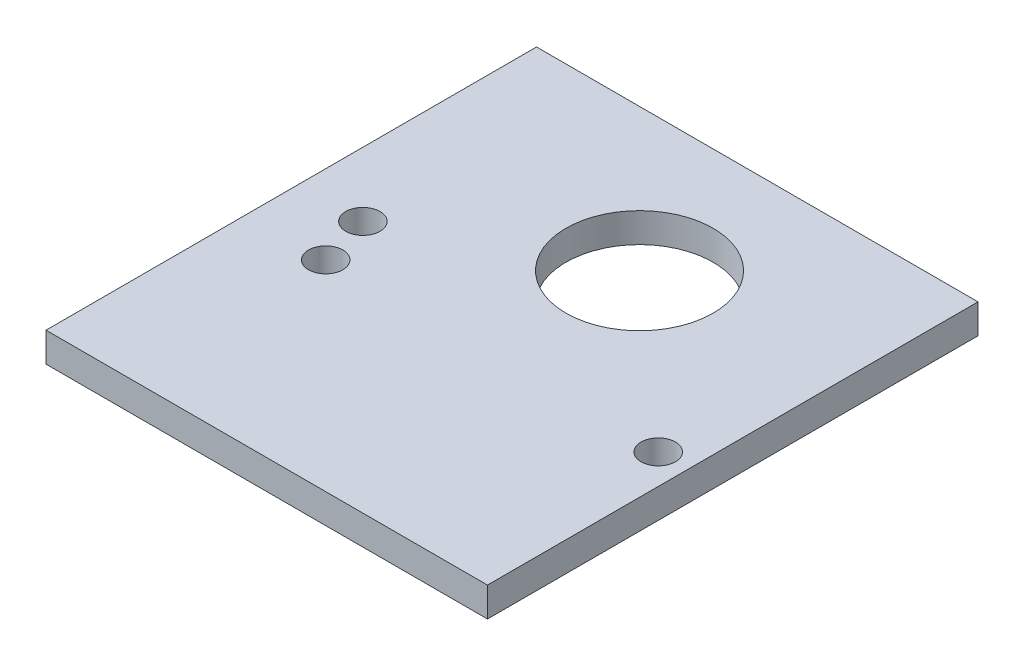
ISO-10303-21;
HEADER;
FILE_DESCRIPTION(('STEP AP214'),'2;1');
FILE_NAME('part.step','',(''),(''),'','','');
FILE_SCHEMA(('AUTOMOTIVE_DESIGN { 1 0 10303 214 1 1 1 1 }'));
ENDSEC;
DATA;
#1=APPLICATION_CONTEXT('core data for automotive mechanical design processes');
#2=APPLICATION_PROTOCOL_DEFINITION('international standard','automotive_design',2000,#1);
#3=PRODUCT_CONTEXT('',#1,'mechanical');
#4=PRODUCT('Part','Part','',(#3));
#5=PRODUCT_RELATED_PRODUCT_CATEGORY('part','',(#4));
#6=PRODUCT_DEFINITION_FORMATION('','',#4);
#7=PRODUCT_DEFINITION_CONTEXT('part definition',#1,'design');
#8=PRODUCT_DEFINITION('design','',#6,#7);
#9=PRODUCT_DEFINITION_SHAPE('','',#8);
#10=(LENGTH_UNIT() NAMED_UNIT(*) SI_UNIT(.MILLI.,.METRE.));
#11=(NAMED_UNIT(*) PLANE_ANGLE_UNIT() SI_UNIT($,.RADIAN.));
#12=(NAMED_UNIT(*) SI_UNIT($,.STERADIAN.) SOLID_ANGLE_UNIT());
#13=UNCERTAINTY_MEASURE_WITH_UNIT(LENGTH_MEASURE(1.E-05),#10,'distance_accuracy_value','');
#14=(GEOMETRIC_REPRESENTATION_CONTEXT(3) GLOBAL_UNCERTAINTY_ASSIGNED_CONTEXT((#13)) GLOBAL_UNIT_ASSIGNED_CONTEXT((#10,
#11,#12)) REPRESENTATION_CONTEXT('',''));
#15=CARTESIAN_POINT('',(0.,0.,0.));
#16=DIRECTION('',(0.,0.,1.));
#17=DIRECTION('',(1.,0.,0.));
#18=AXIS2_PLACEMENT_3D('',#15,#16,#17);
#19=CARTESIAN_POINT('',(-25.,-3.,-22.5));
#20=DIRECTION('',(-1.,0.,0.));
#21=DIRECTION('',(0.,0.,1.));
#22=AXIS2_PLACEMENT_3D('',#19,#20,#21);
#23=PLANE('',#22);
#24=DIRECTION('',(0.,0.,1.));
#25=VECTOR('',#24,1.);
#26=CARTESIAN_POINT('',(-25.,0.,-22.5));
#27=LINE('',#26,#25);
#28=CARTESIAN_POINT('',(-25.,0.,-22.5));
#29=VERTEX_POINT('',#28);
#30=CARTESIAN_POINT('',(-25.,0.,27.5));
#31=VERTEX_POINT('',#30);
#32=EDGE_CURVE('E100',#29,#31,#27,.T.);
#33=ORIENTED_EDGE('',*,*,#32,.F.);
#34=DIRECTION('',(0.,1.,0.));
#35=VECTOR('',#34,1.);
#36=CARTESIAN_POINT('',(-25.,-3.,-22.5));
#37=LINE('',#36,#35);
#38=CARTESIAN_POINT('',(-25.,-3.,-22.5));
#39=VERTEX_POINT('',#38);
#40=EDGE_CURVE('E11',#39,#29,#37,.T.);
#41=ORIENTED_EDGE('',*,*,#40,.F.);
#42=DIRECTION('',(0.,0.,1.));
#43=VECTOR('',#42,1.);
#44=CARTESIAN_POINT('',(-25.,-3.,-22.5));
#45=LINE('',#44,#43);
#46=CARTESIAN_POINT('',(-25.,-3.,27.5));
#47=VERTEX_POINT('',#46);
#48=EDGE_CURVE('E93',#39,#47,#45,.T.);
#49=ORIENTED_EDGE('',*,*,#48,.T.);
#50=DIRECTION('',(0.,1.,0.));
#51=VECTOR('',#50,1.);
#52=CARTESIAN_POINT('',(-25.,-3.,27.5));
#53=LINE('',#52,#51);
#54=EDGE_CURVE('E38',#47,#31,#53,.T.);
#55=ORIENTED_EDGE('',*,*,#54,.T.);
#56=EDGE_LOOP('',(#33,#41,#49,#55));
#57=FACE_BOUND('',#56,.T.);
#58=ADVANCED_FACE('F35',(#57),#23,.T.);
#59=CARTESIAN_POINT('',(-25.,-3.,-22.5));
#60=DIRECTION('',(0.,0.,-1.));
#61=DIRECTION('',(-1.,0.,0.));
#62=AXIS2_PLACEMENT_3D('',#59,#60,#61);
#63=PLANE('',#62);
#64=DIRECTION('',(-1.,0.,0.));
#65=VECTOR('',#64,1.);
#66=CARTESIAN_POINT('',(-25.,0.,-22.5));
#67=LINE('',#66,#65);
#68=CARTESIAN_POINT('',(20.,0.,-22.5));
#69=VERTEX_POINT('',#68);
#70=EDGE_CURVE('E95',#69,#29,#67,.T.);
#71=ORIENTED_EDGE('',*,*,#70,.F.);
#72=DIRECTION('',(0.,1.,0.));
#73=VECTOR('',#72,1.);
#74=CARTESIAN_POINT('',(20.,-3.,-22.5));
#75=LINE('',#74,#73);
#76=CARTESIAN_POINT('',(20.,-3.,-22.5));
#77=VERTEX_POINT('',#76);
#78=EDGE_CURVE('E44',#77,#69,#75,.T.);
#79=ORIENTED_EDGE('',*,*,#78,.F.);
#80=DIRECTION('',(-1.,0.,0.));
#81=VECTOR('',#80,1.);
#82=CARTESIAN_POINT('',(-25.,-3.,-22.5));
#83=LINE('',#82,#81);
#84=EDGE_CURVE('E90',#77,#39,#83,.T.);
#85=ORIENTED_EDGE('',*,*,#84,.T.);
#86=ORIENTED_EDGE('',*,*,#40,.T.);
#87=EDGE_LOOP('',(#71,#79,#85,#86));
#88=FACE_BOUND('',#87,.T.);
#89=ADVANCED_FACE('F111',(#88),#63,.T.);
#90=CARTESIAN_POINT('',(20.,-3.,-22.5));
#91=DIRECTION('',(1.,0.,0.));
#92=DIRECTION('',(0.,0.,-1.));
#93=AXIS2_PLACEMENT_3D('',#90,#91,#92);
#94=PLANE('',#93);
#95=DIRECTION('',(0.,0.,-1.));
#96=VECTOR('',#95,1.);
#97=CARTESIAN_POINT('',(20.,0.,-22.5));
#98=LINE('',#97,#96);
#99=CARTESIAN_POINT('',(20.,0.,27.5));
#100=VERTEX_POINT('',#99);
#101=EDGE_CURVE('E85',#100,#69,#98,.T.);
#102=ORIENTED_EDGE('',*,*,#101,.F.);
#103=DIRECTION('',(0.,1.,0.));
#104=VECTOR('',#103,1.);
#105=CARTESIAN_POINT('',(20.,-3.,27.5));
#106=LINE('',#105,#104);
#107=CARTESIAN_POINT('',(20.,-3.,27.5));
#108=VERTEX_POINT('',#107);
#109=EDGE_CURVE('E80',#108,#100,#106,.T.);
#110=ORIENTED_EDGE('',*,*,#109,.F.);
#111=DIRECTION('',(0.,0.,-1.));
#112=VECTOR('',#111,1.);
#113=CARTESIAN_POINT('',(20.,-3.,-22.5));
#114=LINE('',#113,#112);
#115=EDGE_CURVE('E83',#108,#77,#114,.T.);
#116=ORIENTED_EDGE('',*,*,#115,.T.);
#117=ORIENTED_EDGE('',*,*,#78,.T.);
#118=EDGE_LOOP('',(#102,#110,#116,#117));
#119=FACE_BOUND('',#118,.T.);
#120=ADVANCED_FACE('F82',(#119),#94,.T.);
#121=CARTESIAN_POINT('',(-25.,-3.,27.5));
#122=DIRECTION('',(0.,0.,1.));
#123=DIRECTION('',(1.,0.,0.));
#124=AXIS2_PLACEMENT_3D('',#121,#122,#123);
#125=PLANE('',#124);
#126=DIRECTION('',(1.,0.,0.));
#127=VECTOR('',#126,1.);
#128=CARTESIAN_POINT('',(-25.,0.,27.5));
#129=LINE('',#128,#127);
#130=EDGE_CURVE('E103',#31,#100,#129,.T.);
#131=ORIENTED_EDGE('',*,*,#130,.F.);
#132=ORIENTED_EDGE('',*,*,#54,.F.);
#133=DIRECTION('',(1.,0.,0.));
#134=VECTOR('',#133,1.);
#135=CARTESIAN_POINT('',(-25.,-3.,27.5));
#136=LINE('',#135,#134);
#137=EDGE_CURVE('E89',#47,#108,#136,.T.);
#138=ORIENTED_EDGE('',*,*,#137,.T.);
#139=ORIENTED_EDGE('',*,*,#109,.T.);
#140=EDGE_LOOP('',(#131,#132,#138,#139));
#141=FACE_BOUND('',#140,.T.);
#142=ADVANCED_FACE('F92',(#141),#125,.T.);
#143=CARTESIAN_POINT('',(0.,-3.,0.));
#144=DIRECTION('',(0.,1.,0.));
#145=DIRECTION('',(0.,0.,1.));
#146=AXIS2_PLACEMENT_3D('',#143,#144,#145);
#147=PLANE('',#146);
#148=CARTESIAN_POINT('',(-16.95,-3.,7.04150262212918));
#149=DIRECTION('',(0.,1.,0.));
#150=DIRECTION('',(0.,0.,1.));
#151=AXIS2_PLACEMENT_3D('',#148,#149,#150);
#152=CIRCLE('',#151,1.75);
#153=CARTESIAN_POINT('',(-16.95,-3.,8.79150262212918));
#154=VERTEX_POINT('',#153);
#155=EDGE_CURVE('E152',#154,#154,#152,.F.);
#156=ORIENTED_EDGE('',*,*,#155,.F.);
#157=EDGE_LOOP('',(#156));
#158=FACE_BOUND('',#157,.T.);
#159=CARTESIAN_POINT('',(16.95,-3.,7.04150262212918));
#160=DIRECTION('',(0.,1.,0.));
#161=DIRECTION('',(0.,0.,1.));
#162=AXIS2_PLACEMENT_3D('',#159,#160,#161);
#163=CIRCLE('',#162,1.75);
#164=CARTESIAN_POINT('',(16.95,-3.,8.79150262212918));
#165=VERTEX_POINT('',#164);
#166=EDGE_CURVE('E162',#165,#165,#163,.F.);
#167=ORIENTED_EDGE('',*,*,#166,.F.);
#168=EDGE_LOOP('',(#167));
#169=FACE_BOUND('',#168,.T.);
#170=CARTESIAN_POINT('',(-18.45,-3.,1.75));
#171=DIRECTION('',(0.,1.,0.));
#172=DIRECTION('',(0.,0.,1.));
#173=AXIS2_PLACEMENT_3D('',#170,#171,#172);
#174=CIRCLE('',#173,1.75);
#175=CARTESIAN_POINT('',(-18.45,-3.,3.5));
#176=VERTEX_POINT('',#175);
#177=EDGE_CURVE('E168',#176,#176,#174,.F.);
#178=ORIENTED_EDGE('',*,*,#177,.F.);
#179=EDGE_LOOP('',(#178));
#180=FACE_BOUND('',#179,.T.);
#181=CARTESIAN_POINT('',(0.,-3.,-8.));
#182=DIRECTION('',(0.,1.,0.));
#183=DIRECTION('',(0.,0.,1.));
#184=AXIS2_PLACEMENT_3D('',#181,#182,#183);
#185=CIRCLE('',#184,7.5);
#186=CARTESIAN_POINT('',(0.,-3.,-0.5));
#187=VERTEX_POINT('',#186);
#188=EDGE_CURVE('E104',#187,#187,#185,.T.);
#189=ORIENTED_EDGE('',*,*,#188,.T.);
#190=EDGE_LOOP('',(#189));
#191=FACE_BOUND('',#190,.T.);
#192=ORIENTED_EDGE('',*,*,#48,.F.);
#193=ORIENTED_EDGE('',*,*,#84,.F.);
#194=ORIENTED_EDGE('',*,*,#115,.F.);
#195=ORIENTED_EDGE('',*,*,#137,.F.);
#196=EDGE_LOOP('',(#192,#193,#194,#195));
#197=FACE_BOUND('',#196,.T.);
#198=ADVANCED_FACE('F88',(#158,#169,#180,#191,#197),#147,.F.);
#199=CARTESIAN_POINT('',(0.,0.,0.));
#200=DIRECTION('',(0.,1.,0.));
#201=DIRECTION('',(0.,0.,1.));
#202=AXIS2_PLACEMENT_3D('',#199,#200,#201);
#203=PLANE('',#202);
#204=CARTESIAN_POINT('',(-16.95,0.,7.04150262212918));
#205=DIRECTION('',(0.,1.,0.));
#206=DIRECTION('',(0.,0.,1.));
#207=AXIS2_PLACEMENT_3D('',#204,#205,#206);
#208=CIRCLE('',#207,1.75);
#209=CARTESIAN_POINT('',(-16.95,0.,8.79150262212918));
#210=VERTEX_POINT('',#209);
#211=EDGE_CURVE('E155',#210,#210,#208,.T.);
#212=ORIENTED_EDGE('',*,*,#211,.F.);
#213=EDGE_LOOP('',(#212));
#214=FACE_BOUND('',#213,.T.);
#215=CARTESIAN_POINT('',(16.95,0.,7.04150262212918));
#216=DIRECTION('',(0.,1.,0.));
#217=DIRECTION('',(0.,0.,1.));
#218=AXIS2_PLACEMENT_3D('',#215,#216,#217);
#219=CIRCLE('',#218,1.75);
#220=CARTESIAN_POINT('',(16.95,0.,8.79150262212918));
#221=VERTEX_POINT('',#220);
#222=EDGE_CURVE('E157',#221,#221,#219,.T.);
#223=ORIENTED_EDGE('',*,*,#222,.F.);
#224=EDGE_LOOP('',(#223));
#225=FACE_BOUND('',#224,.T.);
#226=CARTESIAN_POINT('',(-18.45,0.,1.75));
#227=DIRECTION('',(0.,1.,0.));
#228=DIRECTION('',(0.,0.,1.));
#229=AXIS2_PLACEMENT_3D('',#226,#227,#228);
#230=CIRCLE('',#229,1.75);
#231=CARTESIAN_POINT('',(-18.45,0.,3.5));
#232=VERTEX_POINT('',#231);
#233=EDGE_CURVE('E165',#232,#232,#230,.T.);
#234=ORIENTED_EDGE('',*,*,#233,.F.);
#235=EDGE_LOOP('',(#234));
#236=FACE_BOUND('',#235,.T.);
#237=CARTESIAN_POINT('',(0.,0.,-8.));
#238=DIRECTION('',(0.,1.,0.));
#239=DIRECTION('',(0.,0.,1.));
#240=AXIS2_PLACEMENT_3D('',#237,#238,#239);
#241=CIRCLE('',#240,7.5);
#242=CARTESIAN_POINT('',(0.,0.,-0.5));
#243=VERTEX_POINT('',#242);
#244=EDGE_CURVE('E171',#243,#243,#241,.T.);
#245=ORIENTED_EDGE('',*,*,#244,.F.);
#246=EDGE_LOOP('',(#245));
#247=FACE_BOUND('',#246,.T.);
#248=ORIENTED_EDGE('',*,*,#32,.T.);
#249=ORIENTED_EDGE('',*,*,#130,.T.);
#250=ORIENTED_EDGE('',*,*,#101,.T.);
#251=ORIENTED_EDGE('',*,*,#70,.T.);
#252=EDGE_LOOP('',(#248,#249,#250,#251));
#253=FACE_BOUND('',#252,.T.);
#254=ADVANCED_FACE('F110',(#214,#225,#236,#247,#253),#203,.T.);
#255=CARTESIAN_POINT('',(0.,-3.,-8.));
#256=DIRECTION('',(0.,1.,0.));
#257=DIRECTION('',(0.,0.,1.));
#258=AXIS2_PLACEMENT_3D('',#255,#256,#257);
#259=CYLINDRICAL_SURFACE('',#258,7.5);
#260=ORIENTED_EDGE('',*,*,#188,.F.);
#261=EDGE_LOOP('',(#260));
#262=FACE_BOUND('',#261,.T.);
#263=ORIENTED_EDGE('',*,*,#244,.T.);
#264=EDGE_LOOP('',(#263));
#265=FACE_BOUND('',#264,.T.);
#266=ADVANCED_FACE('F129',(#262,#265),#259,.F.);
#267=CARTESIAN_POINT('',(-18.45,-7.94974746830584,1.75));
#268=DIRECTION('',(0.,1.,0.));
#269=DIRECTION('',(0.,0.,1.));
#270=AXIS2_PLACEMENT_3D('',#267,#268,#269);
#271=CYLINDRICAL_SURFACE('',#270,1.75);
#272=ORIENTED_EDGE('',*,*,#177,.T.);
#273=EDGE_LOOP('',(#272));
#274=FACE_BOUND('',#273,.T.);
#275=ORIENTED_EDGE('',*,*,#233,.T.);
#276=EDGE_LOOP('',(#275));
#277=FACE_BOUND('',#276,.T.);
#278=ADVANCED_FACE('F136',(#274,#277),#271,.F.);
#279=CARTESIAN_POINT('',(16.95,-7.94974746830584,7.04150262212918));
#280=DIRECTION('',(0.,1.,0.));
#281=DIRECTION('',(0.,0.,1.));
#282=AXIS2_PLACEMENT_3D('',#279,#280,#281);
#283=CYLINDRICAL_SURFACE('',#282,1.75);
#284=ORIENTED_EDGE('',*,*,#166,.T.);
#285=EDGE_LOOP('',(#284));
#286=FACE_BOUND('',#285,.T.);
#287=ORIENTED_EDGE('',*,*,#222,.T.);
#288=EDGE_LOOP('',(#287));
#289=FACE_BOUND('',#288,.T.);
#290=ADVANCED_FACE('F140',(#286,#289),#283,.F.);
#291=CARTESIAN_POINT('',(-16.95,-7.94974746830584,7.04150262212918));
#292=DIRECTION('',(0.,1.,0.));
#293=DIRECTION('',(0.,0.,1.));
#294=AXIS2_PLACEMENT_3D('',#291,#292,#293);
#295=CYLINDRICAL_SURFACE('',#294,1.75);
#296=ORIENTED_EDGE('',*,*,#155,.T.);
#297=EDGE_LOOP('',(#296));
#298=FACE_BOUND('',#297,.T.);
#299=ORIENTED_EDGE('',*,*,#211,.T.);
#300=EDGE_LOOP('',(#299));
#301=FACE_BOUND('',#300,.T.);
#302=ADVANCED_FACE('F144',(#298,#301),#295,.F.);
#303=CLOSED_SHELL('',(#58,#89,#120,#142,#198,#254,#266,#278,#290,#302));
#304=MANIFOLD_SOLID_BREP('B2',#303);
#305=ADVANCED_BREP_SHAPE_REPRESENTATION('',(#18,#304),#14);
#306=SHAPE_DEFINITION_REPRESENTATION(#9,#305);
ENDSEC;
END-ISO-10303-21;
